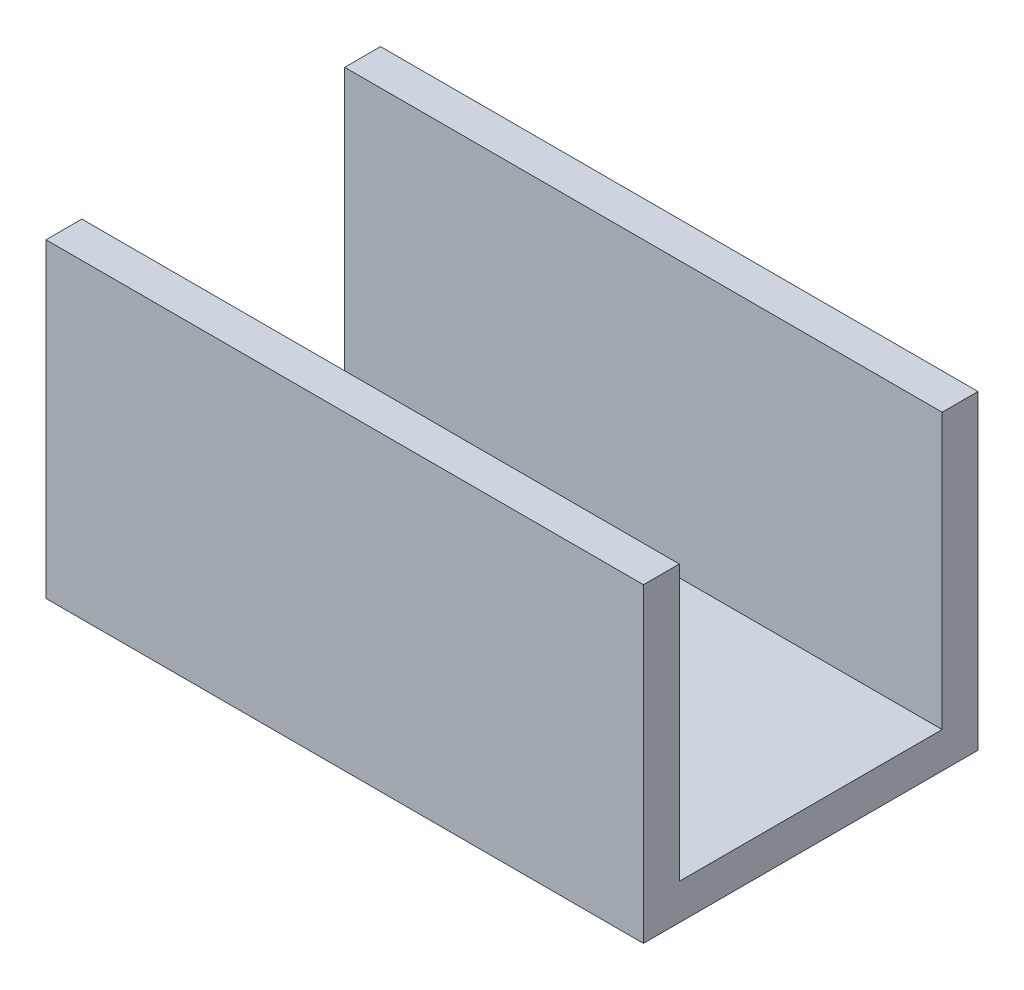
ISO-10303-21;
HEADER;
FILE_DESCRIPTION(('STEP AP214'),'2;1');
FILE_NAME('part.step','',(''),(''),'','','');
FILE_SCHEMA(('AUTOMOTIVE_DESIGN { 1 0 10303 214 1 1 1 1 }'));
ENDSEC;
DATA;
#1=APPLICATION_CONTEXT('core data for automotive mechanical design processes');
#2=APPLICATION_PROTOCOL_DEFINITION('international standard','automotive_design',2000,#1);
#3=PRODUCT_CONTEXT('',#1,'mechanical');
#4=PRODUCT('Part','Part','',(#3));
#5=PRODUCT_RELATED_PRODUCT_CATEGORY('part','',(#4));
#6=PRODUCT_DEFINITION_FORMATION('','',#4);
#7=PRODUCT_DEFINITION_CONTEXT('part definition',#1,'design');
#8=PRODUCT_DEFINITION('design','',#6,#7);
#9=PRODUCT_DEFINITION_SHAPE('','',#8);
#10=(LENGTH_UNIT() NAMED_UNIT(*) SI_UNIT(.MILLI.,.METRE.));
#11=(NAMED_UNIT(*) PLANE_ANGLE_UNIT() SI_UNIT($,.RADIAN.));
#12=(NAMED_UNIT(*) SI_UNIT($,.STERADIAN.) SOLID_ANGLE_UNIT());
#13=UNCERTAINTY_MEASURE_WITH_UNIT(LENGTH_MEASURE(1.E-05),#10,'distance_accuracy_value','');
#14=(GEOMETRIC_REPRESENTATION_CONTEXT(3) GLOBAL_UNCERTAINTY_ASSIGNED_CONTEXT((#13)) GLOBAL_UNIT_ASSIGNED_CONTEXT((#10,
#11,#12)) REPRESENTATION_CONTEXT('',''));
#15=CARTESIAN_POINT('',(0.,0.,0.));
#16=DIRECTION('',(0.,0.,1.));
#17=DIRECTION('',(1.,0.,0.));
#18=AXIS2_PLACEMENT_3D('',#15,#16,#17);
#19=CARTESIAN_POINT('',(0.,52.,0.));
#20=DIRECTION('',(0.,1.,0.));
#21=DIRECTION('',(0.,0.,1.));
#22=AXIS2_PLACEMENT_3D('',#19,#20,#21);
#23=PLANE('',#22);
#24=DIRECTION('',(1.,0.,0.));
#25=VECTOR('',#24,1.);
#26=CARTESIAN_POINT('',(0.,52.,-6.));
#27=LINE('',#26,#25);
#28=CARTESIAN_POINT('',(0.,52.,-6.));
#29=VERTEX_POINT('',#28);
#30=CARTESIAN_POINT('',(100.,52.,-6.));
#31=VERTEX_POINT('',#30);
#32=EDGE_CURVE('E11',#29,#31,#27,.T.);
#33=ORIENTED_EDGE('',*,*,#32,.F.);
#34=DIRECTION('',(0.,0.,-1.));
#35=VECTOR('',#34,1.);
#36=CARTESIAN_POINT('',(0.,52.,0.));
#37=LINE('',#36,#35);
#38=CARTESIAN_POINT('',(0.,52.,0.));
#39=VERTEX_POINT('',#38);
#40=EDGE_CURVE('E155',#39,#29,#37,.T.);
#41=ORIENTED_EDGE('',*,*,#40,.F.);
#42=DIRECTION('',(1.,0.,0.));
#43=VECTOR('',#42,1.);
#44=CARTESIAN_POINT('',(0.,52.,0.));
#45=LINE('',#44,#43);
#46=CARTESIAN_POINT('',(100.,52.,0.));
#47=VERTEX_POINT('',#46);
#48=EDGE_CURVE('E143',#39,#47,#45,.T.);
#49=ORIENTED_EDGE('',*,*,#48,.T.);
#50=DIRECTION('',(0.,0.,-1.));
#51=VECTOR('',#50,1.);
#52=CARTESIAN_POINT('',(100.,52.,0.));
#53=LINE('',#52,#51);
#54=EDGE_CURVE('E92',#47,#31,#53,.T.);
#55=ORIENTED_EDGE('',*,*,#54,.T.);
#56=EDGE_LOOP('',(#33,#41,#49,#55));
#57=FACE_BOUND('',#56,.T.);
#58=ADVANCED_FACE('F43',(#57),#23,.T.);
#59=CARTESIAN_POINT('',(0.,52.,0.));
#60=DIRECTION('',(0.,0.,-1.));
#61=DIRECTION('',(-1.,0.,0.));
#62=AXIS2_PLACEMENT_3D('',#59,#60,#61);
#63=PLANE('',#62);
#64=DIRECTION('',(1.,0.,0.));
#65=VECTOR('',#64,1.);
#66=CARTESIAN_POINT('',(0.,0.,0.));
#67=LINE('',#66,#65);
#68=CARTESIAN_POINT('',(0.,0.,0.));
#69=VERTEX_POINT('',#68);
#70=CARTESIAN_POINT('',(100.,0.,0.));
#71=VERTEX_POINT('',#70);
#72=EDGE_CURVE('E141',#69,#71,#67,.T.);
#73=ORIENTED_EDGE('',*,*,#72,.T.);
#74=DIRECTION('',(0.,-1.,0.));
#75=VECTOR('',#74,1.);
#76=CARTESIAN_POINT('',(100.,52.,0.));
#77=LINE('',#76,#75);
#78=EDGE_CURVE('E169',#47,#71,#77,.T.);
#79=ORIENTED_EDGE('',*,*,#78,.F.);
#80=ORIENTED_EDGE('',*,*,#48,.F.);
#81=DIRECTION('',(0.,-1.,0.));
#82=VECTOR('',#81,1.);
#83=CARTESIAN_POINT('',(0.,52.,0.));
#84=LINE('',#83,#82);
#85=EDGE_CURVE('E69',#39,#69,#84,.T.);
#86=ORIENTED_EDGE('',*,*,#85,.T.);
#87=EDGE_LOOP('',(#73,#79,#80,#86));
#88=FACE_BOUND('',#87,.T.);
#89=ADVANCED_FACE('F44',(#88),#63,.F.);
#90=CARTESIAN_POINT('',(100.,52.,0.));
#91=DIRECTION('',(-1.,0.,0.));
#92=DIRECTION('',(0.,0.,1.));
#93=AXIS2_PLACEMENT_3D('',#90,#91,#92);
#94=PLANE('',#93);
#95=DIRECTION('',(0.,0.,1.));
#96=VECTOR('',#95,1.);
#97=CARTESIAN_POINT('',(100.,6.,-50.));
#98=LINE('',#97,#96);
#99=CARTESIAN_POINT('',(100.,6.,-50.));
#100=VERTEX_POINT('',#99);
#101=CARTESIAN_POINT('',(100.,6.,-6.));
#102=VERTEX_POINT('',#101);
#103=EDGE_CURVE('E121',#100,#102,#98,.T.);
#104=ORIENTED_EDGE('',*,*,#103,.T.);
#105=DIRECTION('',(0.,1.,0.));
#106=VECTOR('',#105,1.);
#107=CARTESIAN_POINT('',(100.,56.,-6.));
#108=LINE('',#107,#106);
#109=EDGE_CURVE('E131',#102,#31,#108,.T.);
#110=ORIENTED_EDGE('',*,*,#109,.T.);
#111=ORIENTED_EDGE('',*,*,#54,.F.);
#112=ORIENTED_EDGE('',*,*,#78,.T.);
#113=DIRECTION('',(0.,0.,-1.));
#114=VECTOR('',#113,1.);
#115=CARTESIAN_POINT('',(100.,0.,0.));
#116=LINE('',#115,#114);
#117=CARTESIAN_POINT('',(100.,0.,-56.));
#118=VERTEX_POINT('',#117);
#119=EDGE_CURVE('E156',#71,#118,#116,.T.);
#120=ORIENTED_EDGE('',*,*,#119,.T.);
#121=DIRECTION('',(0.,-1.,0.));
#122=VECTOR('',#121,1.);
#123=CARTESIAN_POINT('',(100.,52.,-56.));
#124=LINE('',#123,#122);
#125=CARTESIAN_POINT('',(100.,52.,-56.));
#126=VERTEX_POINT('',#125);
#127=EDGE_CURVE('E170',#126,#118,#124,.T.);
#128=ORIENTED_EDGE('',*,*,#127,.F.);
#129=CARTESIAN_POINT('',(100.,52.,-50.));
#130=VERTEX_POINT('',#129);
#131=EDGE_CURVE('E135',#130,#126,#53,.T.);
#132=ORIENTED_EDGE('',*,*,#131,.F.);
#133=DIRECTION('',(0.,-1.,0.));
#134=VECTOR('',#133,1.);
#135=CARTESIAN_POINT('',(100.,56.,-50.));
#136=LINE('',#135,#134);
#137=EDGE_CURVE('E59',#130,#100,#136,.T.);
#138=ORIENTED_EDGE('',*,*,#137,.T.);
#139=EDGE_LOOP('',(#104,#110,#111,#112,#120,#128,#132,#138));
#140=FACE_BOUND('',#139,.T.);
#141=ADVANCED_FACE('F132',(#140),#94,.F.);
#142=CARTESIAN_POINT('',(0.,52.,-56.));
#143=DIRECTION('',(0.,0.,-1.));
#144=DIRECTION('',(-1.,0.,0.));
#145=AXIS2_PLACEMENT_3D('',#142,#143,#144);
#146=PLANE('',#145);
#147=DIRECTION('',(1.,0.,0.));
#148=VECTOR('',#147,1.);
#149=CARTESIAN_POINT('',(0.,0.,-56.));
#150=LINE('',#149,#148);
#151=CARTESIAN_POINT('',(0.,0.,-56.));
#152=VERTEX_POINT('',#151);
#153=EDGE_CURVE('E157',#152,#118,#150,.T.);
#154=ORIENTED_EDGE('',*,*,#153,.F.);
#155=DIRECTION('',(0.,-1.,0.));
#156=VECTOR('',#155,1.);
#157=CARTESIAN_POINT('',(0.,52.,-56.));
#158=LINE('',#157,#156);
#159=CARTESIAN_POINT('',(0.,52.,-56.));
#160=VERTEX_POINT('',#159);
#161=EDGE_CURVE('E164',#160,#152,#158,.T.);
#162=ORIENTED_EDGE('',*,*,#161,.F.);
#163=DIRECTION('',(1.,0.,0.));
#164=VECTOR('',#163,1.);
#165=CARTESIAN_POINT('',(0.,52.,-56.));
#166=LINE('',#165,#164);
#167=EDGE_CURVE('E146',#160,#126,#166,.T.);
#168=ORIENTED_EDGE('',*,*,#167,.T.);
#169=ORIENTED_EDGE('',*,*,#127,.T.);
#170=EDGE_LOOP('',(#154,#162,#168,#169));
#171=FACE_BOUND('',#170,.T.);
#172=ADVANCED_FACE('F177',(#171),#146,.T.);
#173=CARTESIAN_POINT('',(0.,52.,0.));
#174=DIRECTION('',(-1.,0.,0.));
#175=DIRECTION('',(0.,0.,1.));
#176=AXIS2_PLACEMENT_3D('',#173,#174,#175);
#177=PLANE('',#176);
#178=DIRECTION('',(0.,1.,0.));
#179=VECTOR('',#178,1.);
#180=CARTESIAN_POINT('',(0.,56.,-6.));
#181=LINE('',#180,#179);
#182=CARTESIAN_POINT('',(0.,6.,-6.));
#183=VERTEX_POINT('',#182);
#184=EDGE_CURVE('E137',#183,#29,#181,.T.);
#185=ORIENTED_EDGE('',*,*,#184,.F.);
#186=DIRECTION('',(0.,0.,1.));
#187=VECTOR('',#186,1.);
#188=CARTESIAN_POINT('',(0.,6.,-50.));
#189=LINE('',#188,#187);
#190=CARTESIAN_POINT('',(0.,6.,-50.));
#191=VERTEX_POINT('',#190);
#192=EDGE_CURVE('E136',#191,#183,#189,.T.);
#193=ORIENTED_EDGE('',*,*,#192,.F.);
#194=DIRECTION('',(0.,-1.,0.));
#195=VECTOR('',#194,1.);
#196=CARTESIAN_POINT('',(0.,56.,-50.));
#197=LINE('',#196,#195);
#198=CARTESIAN_POINT('',(0.,52.,-50.));
#199=VERTEX_POINT('',#198);
#200=EDGE_CURVE('E118',#199,#191,#197,.T.);
#201=ORIENTED_EDGE('',*,*,#200,.F.);
#202=EDGE_CURVE('E154',#199,#160,#37,.T.);
#203=ORIENTED_EDGE('',*,*,#202,.T.);
#204=ORIENTED_EDGE('',*,*,#161,.T.);
#205=DIRECTION('',(0.,0.,-1.));
#206=VECTOR('',#205,1.);
#207=CARTESIAN_POINT('',(0.,0.,0.));
#208=LINE('',#207,#206);
#209=EDGE_CURVE('E150',#69,#152,#208,.T.);
#210=ORIENTED_EDGE('',*,*,#209,.F.);
#211=ORIENTED_EDGE('',*,*,#85,.F.);
#212=ORIENTED_EDGE('',*,*,#40,.T.);
#213=EDGE_LOOP('',(#185,#193,#201,#203,#204,#210,#211,#212));
#214=FACE_BOUND('',#213,.T.);
#215=ADVANCED_FACE('F173',(#214),#177,.T.);
#216=DIRECTION('',(-1.,0.,0.));
#217=VECTOR('',#216,1.);
#218=CARTESIAN_POINT('',(0.,52.,-50.));
#219=LINE('',#218,#217);
#220=EDGE_CURVE('E51',#130,#199,#219,.T.);
#221=ORIENTED_EDGE('',*,*,#220,.F.);
#222=ORIENTED_EDGE('',*,*,#131,.T.);
#223=ORIENTED_EDGE('',*,*,#167,.F.);
#224=ORIENTED_EDGE('',*,*,#202,.F.);
#225=EDGE_LOOP('',(#221,#222,#223,#224));
#226=FACE_BOUND('',#225,.T.);
#227=ADVANCED_FACE('F176',(#226),#23,.T.);
#228=CARTESIAN_POINT('',(0.,0.,0.));
#229=DIRECTION('',(0.,1.,0.));
#230=DIRECTION('',(0.,0.,1.));
#231=AXIS2_PLACEMENT_3D('',#228,#229,#230);
#232=PLANE('',#231);
#233=ORIENTED_EDGE('',*,*,#72,.F.);
#234=ORIENTED_EDGE('',*,*,#209,.T.);
#235=ORIENTED_EDGE('',*,*,#153,.T.);
#236=ORIENTED_EDGE('',*,*,#119,.F.);
#237=EDGE_LOOP('',(#233,#234,#235,#236));
#238=FACE_BOUND('',#237,.T.);
#239=ADVANCED_FACE('F181',(#238),#232,.F.);
#240=CARTESIAN_POINT('',(100.,56.,-6.));
#241=DIRECTION('',(0.,0.,1.));
#242=DIRECTION('',(0.,-1.,0.));
#243=AXIS2_PLACEMENT_3D('',#240,#241,#242);
#244=PLANE('',#243);
#245=ORIENTED_EDGE('',*,*,#32,.T.);
#246=ORIENTED_EDGE('',*,*,#109,.F.);
#247=DIRECTION('',(-1.,0.,0.));
#248=VECTOR('',#247,1.);
#249=CARTESIAN_POINT('',(100.,6.,-6.));
#250=LINE('',#249,#248);
#251=EDGE_CURVE('E124',#102,#183,#250,.T.);
#252=ORIENTED_EDGE('',*,*,#251,.T.);
#253=ORIENTED_EDGE('',*,*,#184,.T.);
#254=EDGE_LOOP('',(#245,#246,#252,#253));
#255=FACE_BOUND('',#254,.T.);
#256=ADVANCED_FACE('F190',(#255),#244,.F.);
#257=CARTESIAN_POINT('',(100.,6.,-50.));
#258=DIRECTION('',(0.,-1.,0.));
#259=DIRECTION('',(0.,0.,-1.));
#260=AXIS2_PLACEMENT_3D('',#257,#258,#259);
#261=PLANE('',#260);
#262=ORIENTED_EDGE('',*,*,#192,.T.);
#263=ORIENTED_EDGE('',*,*,#251,.F.);
#264=ORIENTED_EDGE('',*,*,#103,.F.);
#265=DIRECTION('',(-1.,0.,0.));
#266=VECTOR('',#265,1.);
#267=CARTESIAN_POINT('',(100.,6.,-50.));
#268=LINE('',#267,#266);
#269=EDGE_CURVE('E114',#100,#191,#268,.T.);
#270=ORIENTED_EDGE('',*,*,#269,.T.);
#271=EDGE_LOOP('',(#262,#263,#264,#270));
#272=FACE_BOUND('',#271,.T.);
#273=ADVANCED_FACE('F130',(#272),#261,.F.);
#274=CARTESIAN_POINT('',(100.,56.,-50.));
#275=DIRECTION('',(0.,0.,-1.));
#276=DIRECTION('',(0.,1.,0.));
#277=AXIS2_PLACEMENT_3D('',#274,#275,#276);
#278=PLANE('',#277);
#279=ORIENTED_EDGE('',*,*,#220,.T.);
#280=ORIENTED_EDGE('',*,*,#200,.T.);
#281=ORIENTED_EDGE('',*,*,#269,.F.);
#282=ORIENTED_EDGE('',*,*,#137,.F.);
#283=EDGE_LOOP('',(#279,#280,#281,#282));
#284=FACE_BOUND('',#283,.T.);
#285=ADVANCED_FACE('F120',(#284),#278,.F.);
#286=CLOSED_SHELL('',(#58,#89,#141,#172,#215,#227,#239,#256,#273,#285));
#287=MANIFOLD_SOLID_BREP('B2',#286);
#288=ADVANCED_BREP_SHAPE_REPRESENTATION('',(#18,#287),#14);
#289=SHAPE_DEFINITION_REPRESENTATION(#9,#288);
ENDSEC;
END-ISO-10303-21;
